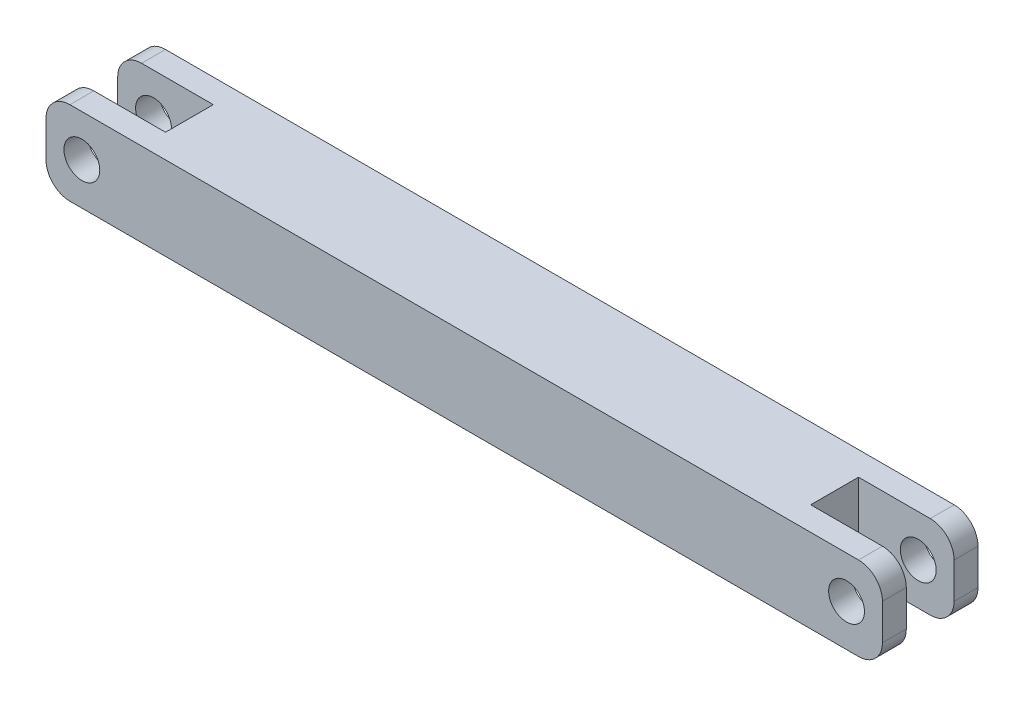
ISO-10303-21;
HEADER;
FILE_DESCRIPTION(('STEP AP214'),'2;1');
FILE_NAME('part.step','',(''),(''),'','','');
FILE_SCHEMA(('AUTOMOTIVE_DESIGN { 1 0 10303 214 1 1 1 1 }'));
ENDSEC;
DATA;
#1=APPLICATION_CONTEXT('core data for automotive mechanical design processes');
#2=APPLICATION_PROTOCOL_DEFINITION('international standard','automotive_design',2000,#1);
#3=PRODUCT_CONTEXT('',#1,'mechanical');
#4=PRODUCT('Part','Part','',(#3));
#5=PRODUCT_RELATED_PRODUCT_CATEGORY('part','',(#4));
#6=PRODUCT_DEFINITION_FORMATION('','',#4);
#7=PRODUCT_DEFINITION_CONTEXT('part definition',#1,'design');
#8=PRODUCT_DEFINITION('design','',#6,#7);
#9=PRODUCT_DEFINITION_SHAPE('','',#8);
#10=(LENGTH_UNIT() NAMED_UNIT(*) SI_UNIT(.MILLI.,.METRE.));
#11=(NAMED_UNIT(*) PLANE_ANGLE_UNIT() SI_UNIT($,.RADIAN.));
#12=(NAMED_UNIT(*) SI_UNIT($,.STERADIAN.) SOLID_ANGLE_UNIT());
#13=UNCERTAINTY_MEASURE_WITH_UNIT(LENGTH_MEASURE(1.E-05),#10,'distance_accuracy_value','');
#14=(GEOMETRIC_REPRESENTATION_CONTEXT(3) GLOBAL_UNCERTAINTY_ASSIGNED_CONTEXT((#13)) GLOBAL_UNIT_ASSIGNED_CONTEXT((#10,
#11,#12)) REPRESENTATION_CONTEXT('',''));
#15=CARTESIAN_POINT('',(0.,0.,0.));
#16=DIRECTION('',(0.,0.,1.));
#17=DIRECTION('',(1.,0.,0.));
#18=AXIS2_PLACEMENT_3D('',#15,#16,#17);
#19=CARTESIAN_POINT('',(175.,17.5,20.));
#20=DIRECTION('',(-1.,0.,0.));
#21=DIRECTION('',(0.,0.,1.));
#22=AXIS2_PLACEMENT_3D('',#19,#20,#21);
#23=PLANE('',#22);
#24=DIRECTION('',(0.,1.,0.));
#25=VECTOR('',#24,1.);
#26=CARTESIAN_POINT('',(175.,17.5,-10.));
#27=LINE('',#26,#25);
#28=CARTESIAN_POINT('',(175.,-7.5,-10.));
#29=VERTEX_POINT('',#28);
#30=CARTESIAN_POINT('',(175.,7.5,-10.));
#31=VERTEX_POINT('',#30);
#32=EDGE_CURVE('E211',#29,#31,#27,.T.);
#33=ORIENTED_EDGE('',*,*,#32,.F.);
#34=DIRECTION('',(0.,0.,-1.));
#35=VECTOR('',#34,1.);
#36=CARTESIAN_POINT('',(175.,-7.5,20.));
#37=LINE('',#36,#35);
#38=CARTESIAN_POINT('',(175.,-7.5,-20.));
#39=VERTEX_POINT('',#38);
#40=EDGE_CURVE('E335',#29,#39,#37,.T.);
#41=ORIENTED_EDGE('',*,*,#40,.T.);
#42=DIRECTION('',(0.,1.,0.));
#43=VECTOR('',#42,1.);
#44=CARTESIAN_POINT('',(175.,17.5,-20.));
#45=LINE('',#44,#43);
#46=CARTESIAN_POINT('',(175.,7.5,-20.));
#47=VERTEX_POINT('',#46);
#48=EDGE_CURVE('E248',#39,#47,#45,.T.);
#49=ORIENTED_EDGE('',*,*,#48,.T.);
#50=DIRECTION('',(0.,0.,-1.));
#51=VECTOR('',#50,1.);
#52=CARTESIAN_POINT('',(175.,7.5,20.));
#53=LINE('',#52,#51);
#54=EDGE_CURVE('E333',#47,#31,#53,.F.);
#55=ORIENTED_EDGE('',*,*,#54,.T.);
#56=EDGE_LOOP('',(#33,#41,#49,#55));
#57=FACE_BOUND('',#56,.T.);
#58=ADVANCED_FACE('F33',(#57),#23,.F.);
#59=DIRECTION('',(0.,1.,0.));
#60=VECTOR('',#59,1.);
#61=CARTESIAN_POINT('',(175.,17.5,20.));
#62=LINE('',#61,#60);
#63=CARTESIAN_POINT('',(175.,-7.5,20.));
#64=VERTEX_POINT('',#63);
#65=CARTESIAN_POINT('',(175.,7.5,20.));
#66=VERTEX_POINT('',#65);
#67=EDGE_CURVE('E249',#64,#66,#62,.T.);
#68=ORIENTED_EDGE('',*,*,#67,.F.);
#69=DIRECTION('',(0.,0.,-1.));
#70=VECTOR('',#69,1.);
#71=CARTESIAN_POINT('',(175.,-7.5,20.));
#72=LINE('',#71,#70);
#73=CARTESIAN_POINT('',(175.,-7.5,10.));
#74=VERTEX_POINT('',#73);
#75=EDGE_CURVE('E318',#64,#74,#72,.T.);
#76=ORIENTED_EDGE('',*,*,#75,.T.);
#77=DIRECTION('',(0.,-1.,0.));
#78=VECTOR('',#77,1.);
#79=CARTESIAN_POINT('',(175.,17.5,10.));
#80=LINE('',#79,#78);
#81=CARTESIAN_POINT('',(175.,7.5,10.));
#82=VERTEX_POINT('',#81);
#83=EDGE_CURVE('E208',#82,#74,#80,.T.);
#84=ORIENTED_EDGE('',*,*,#83,.F.);
#85=DIRECTION('',(0.,0.,-1.));
#86=VECTOR('',#85,1.);
#87=CARTESIAN_POINT('',(175.,7.5,20.));
#88=LINE('',#87,#86);
#89=EDGE_CURVE('E313',#82,#66,#88,.F.);
#90=ORIENTED_EDGE('',*,*,#89,.T.);
#91=EDGE_LOOP('',(#68,#76,#84,#90));
#92=FACE_BOUND('',#91,.T.);
#93=ADVANCED_FACE('F385',(#92),#23,.F.);
#94=CARTESIAN_POINT('',(-175.,17.5,20.));
#95=DIRECTION('',(0.,-1.,0.));
#96=DIRECTION('',(0.,0.,-1.));
#97=AXIS2_PLACEMENT_3D('',#94,#95,#96);
#98=PLANE('',#97);
#99=DIRECTION('',(1.,0.,0.));
#100=VECTOR('',#99,1.);
#101=CARTESIAN_POINT('',(215.,17.5,-10.));
#102=LINE('',#101,#100);
#103=CARTESIAN_POINT('',(135.,17.5,-10.));
#104=VERTEX_POINT('',#103);
#105=CARTESIAN_POINT('',(165.,17.5,-10.));
#106=VERTEX_POINT('',#105);
#107=EDGE_CURVE('E181',#104,#106,#102,.T.);
#108=ORIENTED_EDGE('',*,*,#107,.T.);
#109=DIRECTION('',(0.,0.,-1.));
#110=VECTOR('',#109,1.);
#111=CARTESIAN_POINT('',(165.,17.5,20.));
#112=LINE('',#111,#110);
#113=CARTESIAN_POINT('',(165.,17.5,-20.));
#114=VERTEX_POINT('',#113);
#115=EDGE_CURVE('E11',#106,#114,#112,.T.);
#116=ORIENTED_EDGE('',*,*,#115,.T.);
#117=DIRECTION('',(-1.,0.,0.));
#118=VECTOR('',#117,1.);
#119=CARTESIAN_POINT('',(-175.,17.5,-20.));
#120=LINE('',#119,#118);
#121=CARTESIAN_POINT('',(-165.,17.5,-20.));
#122=VERTEX_POINT('',#121);
#123=EDGE_CURVE('E264',#114,#122,#120,.T.);
#124=ORIENTED_EDGE('',*,*,#123,.T.);
#125=DIRECTION('',(0.,0.,-1.));
#126=VECTOR('',#125,1.);
#127=CARTESIAN_POINT('',(-165.,17.5,20.));
#128=LINE('',#127,#126);
#129=CARTESIAN_POINT('',(-165.,17.5,-10.));
#130=VERTEX_POINT('',#129);
#131=EDGE_CURVE('E310',#122,#130,#128,.F.);
#132=ORIENTED_EDGE('',*,*,#131,.T.);
#133=DIRECTION('',(-1.,0.,0.));
#134=VECTOR('',#133,1.);
#135=CARTESIAN_POINT('',(-215.,17.5,-10.));
#136=LINE('',#135,#134);
#137=CARTESIAN_POINT('',(-135.,17.5,-10.));
#138=VERTEX_POINT('',#137);
#139=EDGE_CURVE('E226',#138,#130,#136,.T.);
#140=ORIENTED_EDGE('',*,*,#139,.F.);
#141=DIRECTION('',(0.,0.,-1.));
#142=VECTOR('',#141,1.);
#143=CARTESIAN_POINT('',(-135.,17.5,-10.));
#144=LINE('',#143,#142);
#145=CARTESIAN_POINT('',(-135.,17.5,10.));
#146=VERTEX_POINT('',#145);
#147=EDGE_CURVE('E223',#146,#138,#144,.T.);
#148=ORIENTED_EDGE('',*,*,#147,.F.);
#149=DIRECTION('',(1.,0.,0.));
#150=VECTOR('',#149,1.);
#151=CARTESIAN_POINT('',(-215.,17.5,10.));
#152=LINE('',#151,#150);
#153=CARTESIAN_POINT('',(-165.,17.5,10.));
#154=VERTEX_POINT('',#153);
#155=EDGE_CURVE('E229',#154,#146,#152,.T.);
#156=ORIENTED_EDGE('',*,*,#155,.F.);
#157=DIRECTION('',(0.,0.,-1.));
#158=VECTOR('',#157,1.);
#159=CARTESIAN_POINT('',(-165.,17.5,20.));
#160=LINE('',#159,#158);
#161=CARTESIAN_POINT('',(-165.,17.5,20.));
#162=VERTEX_POINT('',#161);
#163=EDGE_CURVE('E307',#154,#162,#160,.F.);
#164=ORIENTED_EDGE('',*,*,#163,.T.);
#165=DIRECTION('',(-1.,0.,0.));
#166=VECTOR('',#165,1.);
#167=CARTESIAN_POINT('',(-175.,17.5,20.));
#168=LINE('',#167,#166);
#169=CARTESIAN_POINT('',(165.,17.5,20.));
#170=VERTEX_POINT('',#169);
#171=EDGE_CURVE('E252',#170,#162,#168,.T.);
#172=ORIENTED_EDGE('',*,*,#171,.F.);
#173=DIRECTION('',(0.,0.,-1.));
#174=VECTOR('',#173,1.);
#175=CARTESIAN_POINT('',(165.,17.5,20.));
#176=LINE('',#175,#174);
#177=CARTESIAN_POINT('',(165.,17.5,10.));
#178=VERTEX_POINT('',#177);
#179=EDGE_CURVE('E41',#170,#178,#176,.T.);
#180=ORIENTED_EDGE('',*,*,#179,.T.);
#181=DIRECTION('',(-1.,0.,0.));
#182=VECTOR('',#181,1.);
#183=CARTESIAN_POINT('',(215.,17.5,10.));
#184=LINE('',#183,#182);
#185=CARTESIAN_POINT('',(135.,17.5,10.));
#186=VERTEX_POINT('',#185);
#187=EDGE_CURVE('E173',#178,#186,#184,.T.);
#188=ORIENTED_EDGE('',*,*,#187,.T.);
#189=DIRECTION('',(0.,0.,-1.));
#190=VECTOR('',#189,1.);
#191=CARTESIAN_POINT('',(135.,17.5,-10.));
#192=LINE('',#191,#190);
#193=EDGE_CURVE('E177',#186,#104,#192,.T.);
#194=ORIENTED_EDGE('',*,*,#193,.T.);
#195=EDGE_LOOP('',(#108,#116,#124,#132,#140,#148,#156,#164,#172,#180,#188,#194));
#196=FACE_BOUND('',#195,.T.);
#197=ADVANCED_FACE('F175',(#196),#98,.F.);
#198=CARTESIAN_POINT('',(-175.,-17.5,20.));
#199=DIRECTION('',(0.,1.,0.));
#200=DIRECTION('',(0.,0.,1.));
#201=AXIS2_PLACEMENT_3D('',#198,#199,#200);
#202=PLANE('',#201);
#203=DIRECTION('',(-1.,0.,0.));
#204=VECTOR('',#203,1.);
#205=CARTESIAN_POINT('',(-175.,-17.5,10.));
#206=LINE('',#205,#204);
#207=CARTESIAN_POINT('',(165.,-17.5,10.));
#208=VERTEX_POINT('',#207);
#209=CARTESIAN_POINT('',(135.,-17.5,10.));
#210=VERTEX_POINT('',#209);
#211=EDGE_CURVE('E188',#208,#210,#206,.T.);
#212=ORIENTED_EDGE('',*,*,#211,.F.);
#213=DIRECTION('',(0.,0.,-1.));
#214=VECTOR('',#213,1.);
#215=CARTESIAN_POINT('',(165.,-17.5,20.));
#216=LINE('',#215,#214);
#217=CARTESIAN_POINT('',(165.,-17.5,20.));
#218=VERTEX_POINT('',#217);
#219=EDGE_CURVE('E327',#208,#218,#216,.F.);
#220=ORIENTED_EDGE('',*,*,#219,.T.);
#221=DIRECTION('',(1.,0.,0.));
#222=VECTOR('',#221,1.);
#223=CARTESIAN_POINT('',(-175.,-17.5,20.));
#224=LINE('',#223,#222);
#225=CARTESIAN_POINT('',(-165.,-17.5,20.));
#226=VERTEX_POINT('',#225);
#227=EDGE_CURVE('E258',#226,#218,#224,.T.);
#228=ORIENTED_EDGE('',*,*,#227,.F.);
#229=DIRECTION('',(0.,0.,-1.));
#230=VECTOR('',#229,1.);
#231=CARTESIAN_POINT('',(-165.,-17.5,20.));
#232=LINE('',#231,#230);
#233=CARTESIAN_POINT('',(-165.,-17.5,10.));
#234=VERTEX_POINT('',#233);
#235=EDGE_CURVE('E272',#226,#234,#232,.T.);
#236=ORIENTED_EDGE('',*,*,#235,.T.);
#237=DIRECTION('',(1.,0.,0.));
#238=VECTOR('',#237,1.);
#239=CARTESIAN_POINT('',(-175.,-17.5,10.));
#240=LINE('',#239,#238);
#241=CARTESIAN_POINT('',(-135.,-17.5,10.));
#242=VERTEX_POINT('',#241);
#243=EDGE_CURVE('E261',#234,#242,#240,.T.);
#244=ORIENTED_EDGE('',*,*,#243,.T.);
#245=DIRECTION('',(0.,0.,-1.));
#246=VECTOR('',#245,1.);
#247=CARTESIAN_POINT('',(-135.,-17.5,-10.));
#248=LINE('',#247,#246);
#249=CARTESIAN_POINT('',(-135.,-17.5,-10.));
#250=VERTEX_POINT('',#249);
#251=EDGE_CURVE('E231',#242,#250,#248,.T.);
#252=ORIENTED_EDGE('',*,*,#251,.T.);
#253=DIRECTION('',(-1.,0.,0.));
#254=VECTOR('',#253,1.);
#255=CARTESIAN_POINT('',(-215.,-17.5,-10.));
#256=LINE('',#255,#254);
#257=CARTESIAN_POINT('',(-165.,-17.5,-10.));
#258=VERTEX_POINT('',#257);
#259=EDGE_CURVE('E234',#250,#258,#256,.T.);
#260=ORIENTED_EDGE('',*,*,#259,.T.);
#261=DIRECTION('',(0.,0.,-1.));
#262=VECTOR('',#261,1.);
#263=CARTESIAN_POINT('',(-165.,-17.5,20.));
#264=LINE('',#263,#262);
#265=CARTESIAN_POINT('',(-165.,-17.5,-20.));
#266=VERTEX_POINT('',#265);
#267=EDGE_CURVE('E277',#258,#266,#264,.T.);
#268=ORIENTED_EDGE('',*,*,#267,.T.);
#269=DIRECTION('',(1.,0.,0.));
#270=VECTOR('',#269,1.);
#271=CARTESIAN_POINT('',(-175.,-17.5,-20.));
#272=LINE('',#271,#270);
#273=CARTESIAN_POINT('',(165.,-17.5,-20.));
#274=VERTEX_POINT('',#273);
#275=EDGE_CURVE('E253',#266,#274,#272,.T.);
#276=ORIENTED_EDGE('',*,*,#275,.T.);
#277=DIRECTION('',(0.,0.,-1.));
#278=VECTOR('',#277,1.);
#279=CARTESIAN_POINT('',(165.,-17.5,20.));
#280=LINE('',#279,#278);
#281=CARTESIAN_POINT('',(165.,-17.5,-10.));
#282=VERTEX_POINT('',#281);
#283=EDGE_CURVE('E325',#274,#282,#280,.F.);
#284=ORIENTED_EDGE('',*,*,#283,.T.);
#285=DIRECTION('',(1.,0.,0.));
#286=VECTOR('',#285,1.);
#287=CARTESIAN_POINT('',(215.,-17.5,-10.));
#288=LINE('',#287,#286);
#289=CARTESIAN_POINT('',(135.,-17.5,-10.));
#290=VERTEX_POINT('',#289);
#291=EDGE_CURVE('E192',#290,#282,#288,.T.);
#292=ORIENTED_EDGE('',*,*,#291,.F.);
#293=DIRECTION('',(0.,0.,-1.));
#294=VECTOR('',#293,1.);
#295=CARTESIAN_POINT('',(135.,-17.5,-10.));
#296=LINE('',#295,#294);
#297=EDGE_CURVE('E204',#210,#290,#296,.T.);
#298=ORIENTED_EDGE('',*,*,#297,.F.);
#299=EDGE_LOOP('',(#212,#220,#228,#236,#244,#252,#260,#268,#276,#284,#292,#298));
#300=FACE_BOUND('',#299,.T.);
#301=ADVANCED_FACE('F357',(#300),#202,.F.);
#302=CARTESIAN_POINT('',(-175.,17.5,20.));
#303=DIRECTION('',(1.,0.,0.));
#304=DIRECTION('',(0.,0.,-1.));
#305=AXIS2_PLACEMENT_3D('',#302,#303,#304);
#306=PLANE('',#305);
#307=DIRECTION('',(0.,-1.,0.));
#308=VECTOR('',#307,1.);
#309=CARTESIAN_POINT('',(-175.,17.5,10.));
#310=LINE('',#309,#308);
#311=CARTESIAN_POINT('',(-175.,7.5,10.));
#312=VERTEX_POINT('',#311);
#313=CARTESIAN_POINT('',(-175.,-7.5,10.));
#314=VERTEX_POINT('',#313);
#315=EDGE_CURVE('E245',#312,#314,#310,.T.);
#316=ORIENTED_EDGE('',*,*,#315,.T.);
#317=DIRECTION('',(0.,0.,-1.));
#318=VECTOR('',#317,1.);
#319=CARTESIAN_POINT('',(-175.,-7.5,20.));
#320=LINE('',#319,#318);
#321=CARTESIAN_POINT('',(-175.,-7.5,20.));
#322=VERTEX_POINT('',#321);
#323=EDGE_CURVE('E301',#314,#322,#320,.F.);
#324=ORIENTED_EDGE('',*,*,#323,.T.);
#325=DIRECTION('',(0.,-1.,0.));
#326=VECTOR('',#325,1.);
#327=CARTESIAN_POINT('',(-175.,17.5,20.));
#328=LINE('',#327,#326);
#329=CARTESIAN_POINT('',(-175.,7.5,20.));
#330=VERTEX_POINT('',#329);
#331=EDGE_CURVE('E255',#330,#322,#328,.T.);
#332=ORIENTED_EDGE('',*,*,#331,.F.);
#333=DIRECTION('',(0.,0.,-1.));
#334=VECTOR('',#333,1.);
#335=CARTESIAN_POINT('',(-175.,7.5,20.));
#336=LINE('',#335,#334);
#337=EDGE_CURVE('E298',#330,#312,#336,.T.);
#338=ORIENTED_EDGE('',*,*,#337,.T.);
#339=EDGE_LOOP('',(#316,#324,#332,#338));
#340=FACE_BOUND('',#339,.T.);
#341=ADVANCED_FACE('F434',(#340),#306,.F.);
#342=DIRECTION('',(0.,-1.,0.));
#343=VECTOR('',#342,1.);
#344=CARTESIAN_POINT('',(-175.,17.5,-20.));
#345=LINE('',#344,#343);
#346=CARTESIAN_POINT('',(-175.,7.5,-20.));
#347=VERTEX_POINT('',#346);
#348=CARTESIAN_POINT('',(-175.,-7.5,-20.));
#349=VERTEX_POINT('',#348);
#350=EDGE_CURVE('E266',#347,#349,#345,.T.);
#351=ORIENTED_EDGE('',*,*,#350,.T.);
#352=DIRECTION('',(0.,0.,-1.));
#353=VECTOR('',#352,1.);
#354=CARTESIAN_POINT('',(-175.,-7.5,20.));
#355=LINE('',#354,#353);
#356=CARTESIAN_POINT('',(-175.,-7.5,-10.));
#357=VERTEX_POINT('',#356);
#358=EDGE_CURVE('E288',#349,#357,#355,.F.);
#359=ORIENTED_EDGE('',*,*,#358,.T.);
#360=DIRECTION('',(0.,1.,0.));
#361=VECTOR('',#360,1.);
#362=CARTESIAN_POINT('',(-175.,17.5,-10.));
#363=LINE('',#362,#361);
#364=CARTESIAN_POINT('',(-175.,7.5,-10.));
#365=VERTEX_POINT('',#364);
#366=EDGE_CURVE('E241',#357,#365,#363,.T.);
#367=ORIENTED_EDGE('',*,*,#366,.T.);
#368=DIRECTION('',(0.,0.,-1.));
#369=VECTOR('',#368,1.);
#370=CARTESIAN_POINT('',(-175.,7.5,20.));
#371=LINE('',#370,#369);
#372=EDGE_CURVE('E285',#365,#347,#371,.T.);
#373=ORIENTED_EDGE('',*,*,#372,.T.);
#374=EDGE_LOOP('',(#351,#359,#367,#373));
#375=FACE_BOUND('',#374,.T.);
#376=ADVANCED_FACE('F366',(#375),#306,.F.);
#377=CARTESIAN_POINT('',(0.,0.,20.));
#378=DIRECTION('',(0.,0.,1.));
#379=DIRECTION('',(1.,0.,0.));
#380=AXIS2_PLACEMENT_3D('',#377,#378,#379);
#381=PLANE('',#380);
#382=CARTESIAN_POINT('',(160.,0.,20.));
#383=DIRECTION('',(0.,0.,-1.));
#384=DIRECTION('',(-1.,0.,0.));
#385=AXIS2_PLACEMENT_3D('',#382,#383,#384);
#386=CIRCLE('',#385,7.50000000000001);
#387=CARTESIAN_POINT('',(152.5,0.,20.));
#388=VERTEX_POINT('',#387);
#389=EDGE_CURVE('E639',#388,#388,#386,.T.);
#390=ORIENTED_EDGE('',*,*,#389,.T.);
#391=EDGE_LOOP('',(#390));
#392=FACE_BOUND('',#391,.T.);
#393=CARTESIAN_POINT('',(-160.,0.,20.));
#394=DIRECTION('',(0.,0.,1.));
#395=DIRECTION('',(1.,0.,0.));
#396=AXIS2_PLACEMENT_3D('',#393,#394,#395);
#397=CIRCLE('',#396,7.50000000000001);
#398=CARTESIAN_POINT('',(-152.5,0.,20.));
#399=VERTEX_POINT('',#398);
#400=EDGE_CURVE('E213',#399,#399,#397,.T.);
#401=ORIENTED_EDGE('',*,*,#400,.F.);
#402=EDGE_LOOP('',(#401));
#403=FACE_BOUND('',#402,.T.);
#404=ORIENTED_EDGE('',*,*,#227,.T.);
#405=CARTESIAN_POINT('',(165.,-7.5,20.));
#406=DIRECTION('',(0.,0.,1.));
#407=DIRECTION('',(1.,0.,0.));
#408=AXIS2_PLACEMENT_3D('',#405,#406,#407);
#409=CIRCLE('',#408,10.);
#410=EDGE_CURVE('E331',#218,#64,#409,.T.);
#411=ORIENTED_EDGE('',*,*,#410,.T.);
#412=ORIENTED_EDGE('',*,*,#67,.T.);
#413=CARTESIAN_POINT('',(165.,7.5,20.));
#414=DIRECTION('',(0.,0.,1.));
#415=DIRECTION('',(1.,0.,0.));
#416=AXIS2_PLACEMENT_3D('',#413,#414,#415);
#417=CIRCLE('',#416,10.);
#418=EDGE_CURVE('E329',#66,#170,#417,.T.);
#419=ORIENTED_EDGE('',*,*,#418,.T.);
#420=ORIENTED_EDGE('',*,*,#171,.T.);
#421=CARTESIAN_POINT('',(-165.,7.5,20.));
#422=DIRECTION('',(0.,0.,1.));
#423=DIRECTION('',(1.,0.,0.));
#424=AXIS2_PLACEMENT_3D('',#421,#422,#423);
#425=CIRCLE('',#424,10.);
#426=EDGE_CURVE('E303',#162,#330,#425,.T.);
#427=ORIENTED_EDGE('',*,*,#426,.T.);
#428=ORIENTED_EDGE('',*,*,#331,.T.);
#429=CARTESIAN_POINT('',(-165.,-7.5,20.));
#430=DIRECTION('',(0.,0.,1.));
#431=DIRECTION('',(1.,0.,0.));
#432=AXIS2_PLACEMENT_3D('',#429,#430,#431);
#433=CIRCLE('',#432,10.);
#434=EDGE_CURVE('E305',#322,#226,#433,.T.);
#435=ORIENTED_EDGE('',*,*,#434,.T.);
#436=EDGE_LOOP('',(#404,#411,#412,#419,#420,#427,#428,#435));
#437=FACE_BOUND('',#436,.T.);
#438=ADVANCED_FACE('F421',(#392,#403,#437),#381,.T.);
#439=CARTESIAN_POINT('',(0.,0.,-20.));
#440=DIRECTION('',(0.,0.,1.));
#441=DIRECTION('',(1.,0.,0.));
#442=AXIS2_PLACEMENT_3D('',#439,#440,#441);
#443=PLANE('',#442);
#444=CARTESIAN_POINT('',(160.,0.,-20.));
#445=DIRECTION('',(0.,0.,-1.));
#446=DIRECTION('',(-1.,0.,0.));
#447=AXIS2_PLACEMENT_3D('',#444,#445,#446);
#448=CIRCLE('',#447,7.50000000000001);
#449=CARTESIAN_POINT('',(152.5,0.,-20.));
#450=VERTEX_POINT('',#449);
#451=EDGE_CURVE('E316',#450,#450,#448,.T.);
#452=ORIENTED_EDGE('',*,*,#451,.F.);
#453=EDGE_LOOP('',(#452));
#454=FACE_BOUND('',#453,.T.);
#455=CARTESIAN_POINT('',(-160.,0.,-20.));
#456=DIRECTION('',(0.,0.,1.));
#457=DIRECTION('',(1.,0.,0.));
#458=AXIS2_PLACEMENT_3D('',#455,#456,#457);
#459=CIRCLE('',#458,7.50000000000001);
#460=CARTESIAN_POINT('',(-152.5,0.,-20.));
#461=VERTEX_POINT('',#460);
#462=EDGE_CURVE('E216',#461,#461,#459,.T.);
#463=ORIENTED_EDGE('',*,*,#462,.T.);
#464=EDGE_LOOP('',(#463));
#465=FACE_BOUND('',#464,.T.);
#466=ORIENTED_EDGE('',*,*,#48,.F.);
#467=CARTESIAN_POINT('',(165.,-7.5,-20.));
#468=DIRECTION('',(0.,0.,1.));
#469=DIRECTION('',(1.,0.,0.));
#470=AXIS2_PLACEMENT_3D('',#467,#468,#469);
#471=CIRCLE('',#470,10.);
#472=EDGE_CURVE('E339',#39,#274,#471,.F.);
#473=ORIENTED_EDGE('',*,*,#472,.T.);
#474=ORIENTED_EDGE('',*,*,#275,.F.);
#475=CARTESIAN_POINT('',(-165.,-7.5,-20.));
#476=DIRECTION('',(0.,0.,1.));
#477=DIRECTION('',(1.,0.,0.));
#478=AXIS2_PLACEMENT_3D('',#475,#476,#477);
#479=CIRCLE('',#478,10.);
#480=EDGE_CURVE('E283',#266,#349,#479,.F.);
#481=ORIENTED_EDGE('',*,*,#480,.T.);
#482=ORIENTED_EDGE('',*,*,#350,.F.);
#483=CARTESIAN_POINT('',(-165.,7.5,-20.));
#484=DIRECTION('',(0.,0.,1.));
#485=DIRECTION('',(1.,0.,0.));
#486=AXIS2_PLACEMENT_3D('',#483,#484,#485);
#487=CIRCLE('',#486,10.);
#488=EDGE_CURVE('E280',#347,#122,#487,.F.);
#489=ORIENTED_EDGE('',*,*,#488,.T.);
#490=ORIENTED_EDGE('',*,*,#123,.F.);
#491=CARTESIAN_POINT('',(165.,7.5,-20.));
#492=DIRECTION('',(0.,0.,1.));
#493=DIRECTION('',(1.,0.,0.));
#494=AXIS2_PLACEMENT_3D('',#491,#492,#493);
#495=CIRCLE('',#494,10.);
#496=EDGE_CURVE('E56',#114,#47,#495,.F.);
#497=ORIENTED_EDGE('',*,*,#496,.T.);
#498=EDGE_LOOP('',(#466,#473,#474,#481,#482,#489,#490,#497));
#499=FACE_BOUND('',#498,.T.);
#500=ADVANCED_FACE('F355',(#454,#465,#499),#443,.F.);
#501=CARTESIAN_POINT('',(-215.,-17.5,10.));
#502=DIRECTION('',(0.,0.,1.));
#503=DIRECTION('',(1.,0.,0.));
#504=AXIS2_PLACEMENT_3D('',#501,#502,#503);
#505=PLANE('',#504);
#506=CARTESIAN_POINT('',(-160.,0.,10.));
#507=DIRECTION('',(0.,0.,1.));
#508=DIRECTION('',(1.,0.,0.));
#509=AXIS2_PLACEMENT_3D('',#506,#507,#508);
#510=CIRCLE('',#509,7.50000000000001);
#511=CARTESIAN_POINT('',(-152.5,0.,10.));
#512=VERTEX_POINT('',#511);
#513=EDGE_CURVE('E220',#512,#512,#510,.T.);
#514=ORIENTED_EDGE('',*,*,#513,.T.);
#515=EDGE_LOOP('',(#514));
#516=FACE_BOUND('',#515,.T.);
#517=ORIENTED_EDGE('',*,*,#243,.F.);
#518=CARTESIAN_POINT('',(-165.,-7.5,10.));
#519=DIRECTION('',(0.,0.,1.));
#520=DIRECTION('',(1.,0.,0.));
#521=AXIS2_PLACEMENT_3D('',#518,#519,#520);
#522=CIRCLE('',#521,10.);
#523=EDGE_CURVE('E296',#234,#314,#522,.F.);
#524=ORIENTED_EDGE('',*,*,#523,.T.);
#525=ORIENTED_EDGE('',*,*,#315,.F.);
#526=CARTESIAN_POINT('',(-165.,7.5,10.));
#527=DIRECTION('',(0.,0.,1.));
#528=DIRECTION('',(1.,0.,0.));
#529=AXIS2_PLACEMENT_3D('',#526,#527,#528);
#530=CIRCLE('',#529,10.);
#531=EDGE_CURVE('E294',#312,#154,#530,.F.);
#532=ORIENTED_EDGE('',*,*,#531,.T.);
#533=ORIENTED_EDGE('',*,*,#155,.T.);
#534=DIRECTION('',(0.,1.,0.));
#535=VECTOR('',#534,1.);
#536=CARTESIAN_POINT('',(-135.,-17.5,10.));
#537=LINE('',#536,#535);
#538=EDGE_CURVE('E238',#242,#146,#537,.T.);
#539=ORIENTED_EDGE('',*,*,#538,.F.);
#540=EDGE_LOOP('',(#517,#524,#525,#532,#533,#539));
#541=FACE_BOUND('',#540,.T.);
#542=ADVANCED_FACE('F441',(#516,#541),#505,.F.);
#543=CARTESIAN_POINT('',(-215.,-17.5,-10.));
#544=DIRECTION('',(0.,0.,-1.));
#545=DIRECTION('',(-1.,0.,0.));
#546=AXIS2_PLACEMENT_3D('',#543,#544,#545);
#547=PLANE('',#546);
#548=CARTESIAN_POINT('',(-160.,0.,-10.));
#549=DIRECTION('',(0.,0.,-1.));
#550=DIRECTION('',(-1.,0.,0.));
#551=AXIS2_PLACEMENT_3D('',#548,#549,#550);
#552=CIRCLE('',#551,7.50000000000001);
#553=CARTESIAN_POINT('',(-167.5,0.,-10.));
#554=VERTEX_POINT('',#553);
#555=EDGE_CURVE('E219',#554,#554,#552,.T.);
#556=ORIENTED_EDGE('',*,*,#555,.T.);
#557=EDGE_LOOP('',(#556));
#558=FACE_BOUND('',#557,.T.);
#559=ORIENTED_EDGE('',*,*,#366,.F.);
#560=CARTESIAN_POINT('',(-165.,-7.5,-10.));
#561=DIRECTION('',(0.,0.,-1.));
#562=DIRECTION('',(-1.,0.,0.));
#563=AXIS2_PLACEMENT_3D('',#560,#561,#562);
#564=CIRCLE('',#563,10.);
#565=EDGE_CURVE('E292',#357,#258,#564,.F.);
#566=ORIENTED_EDGE('',*,*,#565,.T.);
#567=ORIENTED_EDGE('',*,*,#259,.F.);
#568=DIRECTION('',(0.,1.,0.));
#569=VECTOR('',#568,1.);
#570=CARTESIAN_POINT('',(-135.,-17.5,-10.));
#571=LINE('',#570,#569);
#572=EDGE_CURVE('E237',#250,#138,#571,.T.);
#573=ORIENTED_EDGE('',*,*,#572,.T.);
#574=ORIENTED_EDGE('',*,*,#139,.T.);
#575=CARTESIAN_POINT('',(-165.,7.5,-10.));
#576=DIRECTION('',(0.,0.,-1.));
#577=DIRECTION('',(-1.,0.,0.));
#578=AXIS2_PLACEMENT_3D('',#575,#576,#577);
#579=CIRCLE('',#578,10.);
#580=EDGE_CURVE('E290',#130,#365,#579,.F.);
#581=ORIENTED_EDGE('',*,*,#580,.T.);
#582=EDGE_LOOP('',(#559,#566,#567,#573,#574,#581));
#583=FACE_BOUND('',#582,.T.);
#584=ADVANCED_FACE('F446',(#558,#583),#547,.F.);
#585=CARTESIAN_POINT('',(-135.,-17.5,-10.));
#586=DIRECTION('',(1.,0.,0.));
#587=DIRECTION('',(0.,0.,-1.));
#588=AXIS2_PLACEMENT_3D('',#585,#586,#587);
#589=PLANE('',#588);
#590=ORIENTED_EDGE('',*,*,#572,.F.);
#591=ORIENTED_EDGE('',*,*,#251,.F.);
#592=ORIENTED_EDGE('',*,*,#538,.T.);
#593=ORIENTED_EDGE('',*,*,#147,.T.);
#594=EDGE_LOOP('',(#590,#591,#592,#593));
#595=FACE_BOUND('',#594,.T.);
#596=ADVANCED_FACE('F444',(#595),#589,.F.);
#597=CARTESIAN_POINT('',(-160.,0.,-20.));
#598=DIRECTION('',(0.,0.,1.));
#599=DIRECTION('',(1.,0.,0.));
#600=AXIS2_PLACEMENT_3D('',#597,#598,#599);
#601=CYLINDRICAL_SURFACE('',#600,7.50000000000001);
#602=ORIENTED_EDGE('',*,*,#462,.F.);
#603=EDGE_LOOP('',(#602));
#604=FACE_BOUND('',#603,.T.);
#605=ORIENTED_EDGE('',*,*,#555,.F.);
#606=EDGE_LOOP('',(#605));
#607=FACE_BOUND('',#606,.T.);
#608=ADVANCED_FACE('F454',(#604,#607),#601,.F.);
#609=ORIENTED_EDGE('',*,*,#400,.T.);
#610=EDGE_LOOP('',(#609));
#611=FACE_BOUND('',#610,.T.);
#612=ORIENTED_EDGE('',*,*,#513,.F.);
#613=EDGE_LOOP('',(#612));
#614=FACE_BOUND('',#613,.T.);
#615=ADVANCED_FACE('F397',(#611,#614),#601,.F.);
#616=CARTESIAN_POINT('',(-165.,-7.5,20.));
#617=DIRECTION('',(0.,0.,-1.));
#618=DIRECTION('',(-1.,0.,0.));
#619=AXIS2_PLACEMENT_3D('',#616,#617,#618);
#620=CYLINDRICAL_SURFACE('',#619,10.);
#621=ORIENTED_EDGE('',*,*,#565,.F.);
#622=ORIENTED_EDGE('',*,*,#358,.F.);
#623=ORIENTED_EDGE('',*,*,#480,.F.);
#624=ORIENTED_EDGE('',*,*,#267,.F.);
#625=EDGE_LOOP('',(#621,#622,#623,#624));
#626=FACE_BOUND('',#625,.T.);
#627=ADVANCED_FACE('F362',(#626),#620,.T.);
#628=CARTESIAN_POINT('',(-165.,-7.5,20.));
#629=DIRECTION('',(0.,0.,-1.));
#630=DIRECTION('',(-1.,0.,0.));
#631=AXIS2_PLACEMENT_3D('',#628,#629,#630);
#632=CYLINDRICAL_SURFACE('',#631,10.);
#633=ORIENTED_EDGE('',*,*,#434,.F.);
#634=ORIENTED_EDGE('',*,*,#323,.F.);
#635=ORIENTED_EDGE('',*,*,#523,.F.);
#636=ORIENTED_EDGE('',*,*,#235,.F.);
#637=EDGE_LOOP('',(#633,#634,#635,#636));
#638=FACE_BOUND('',#637,.T.);
#639=ADVANCED_FACE('F396',(#638),#632,.T.);
#640=CARTESIAN_POINT('',(-165.,7.5,20.));
#641=DIRECTION('',(0.,0.,-1.));
#642=DIRECTION('',(-1.,0.,0.));
#643=AXIS2_PLACEMENT_3D('',#640,#641,#642);
#644=CYLINDRICAL_SURFACE('',#643,10.);
#645=ORIENTED_EDGE('',*,*,#580,.F.);
#646=ORIENTED_EDGE('',*,*,#131,.F.);
#647=ORIENTED_EDGE('',*,*,#488,.F.);
#648=ORIENTED_EDGE('',*,*,#372,.F.);
#649=EDGE_LOOP('',(#645,#646,#647,#648));
#650=FACE_BOUND('',#649,.T.);
#651=ADVANCED_FACE('F371',(#650),#644,.T.);
#652=CARTESIAN_POINT('',(-165.,7.5,20.));
#653=DIRECTION('',(0.,0.,-1.));
#654=DIRECTION('',(-1.,0.,0.));
#655=AXIS2_PLACEMENT_3D('',#652,#653,#654);
#656=CYLINDRICAL_SURFACE('',#655,10.);
#657=ORIENTED_EDGE('',*,*,#426,.F.);
#658=ORIENTED_EDGE('',*,*,#163,.F.);
#659=ORIENTED_EDGE('',*,*,#531,.F.);
#660=ORIENTED_EDGE('',*,*,#337,.F.);
#661=EDGE_LOOP('',(#657,#658,#659,#660));
#662=FACE_BOUND('',#661,.T.);
#663=ADVANCED_FACE('F403',(#662),#656,.T.);
#664=CARTESIAN_POINT('',(215.,-17.5,-10.));
#665=DIRECTION('',(0.,0.,1.));
#666=DIRECTION('',(1.,0.,0.));
#667=AXIS2_PLACEMENT_3D('',#664,#665,#666);
#668=PLANE('',#667);
#669=CARTESIAN_POINT('',(160.,0.,-10.));
#670=DIRECTION('',(0.,0.,1.));
#671=DIRECTION('',(1.,0.,0.));
#672=AXIS2_PLACEMENT_3D('',#669,#670,#671);
#673=CIRCLE('',#672,7.50000000000001);
#674=CARTESIAN_POINT('',(167.5,0.,-10.));
#675=VERTEX_POINT('',#674);
#676=EDGE_CURVE('E196',#675,#675,#673,.F.);
#677=ORIENTED_EDGE('',*,*,#676,.T.);
#678=EDGE_LOOP('',(#677));
#679=FACE_BOUND('',#678,.T.);
#680=ORIENTED_EDGE('',*,*,#291,.T.);
#681=CARTESIAN_POINT('',(165.,-7.5,-10.));
#682=DIRECTION('',(0.,0.,1.));
#683=DIRECTION('',(1.,0.,0.));
#684=AXIS2_PLACEMENT_3D('',#681,#682,#683);
#685=CIRCLE('',#684,10.);
#686=EDGE_CURVE('E342',#282,#29,#685,.T.);
#687=ORIENTED_EDGE('',*,*,#686,.T.);
#688=ORIENTED_EDGE('',*,*,#32,.T.);
#689=CARTESIAN_POINT('',(165.,7.5,-10.));
#690=DIRECTION('',(0.,0.,1.));
#691=DIRECTION('',(1.,0.,0.));
#692=AXIS2_PLACEMENT_3D('',#689,#690,#691);
#693=CIRCLE('',#692,10.);
#694=EDGE_CURVE('E48',#31,#106,#693,.T.);
#695=ORIENTED_EDGE('',*,*,#694,.T.);
#696=ORIENTED_EDGE('',*,*,#107,.F.);
#697=DIRECTION('',(0.,1.,0.));
#698=VECTOR('',#697,1.);
#699=CARTESIAN_POINT('',(135.,-17.5,-10.));
#700=LINE('',#699,#698);
#701=EDGE_CURVE('E191',#290,#104,#700,.T.);
#702=ORIENTED_EDGE('',*,*,#701,.F.);
#703=EDGE_LOOP('',(#680,#687,#688,#695,#696,#702));
#704=FACE_BOUND('',#703,.T.);
#705=ADVANCED_FACE('F345',(#679,#704),#668,.T.);
#706=CARTESIAN_POINT('',(215.,-17.5,10.));
#707=DIRECTION('',(0.,0.,-1.));
#708=DIRECTION('',(-1.,0.,0.));
#709=AXIS2_PLACEMENT_3D('',#706,#707,#708);
#710=PLANE('',#709);
#711=CARTESIAN_POINT('',(160.,0.,10.));
#712=DIRECTION('',(0.,0.,-1.));
#713=DIRECTION('',(-1.,0.,0.));
#714=AXIS2_PLACEMENT_3D('',#711,#712,#713);
#715=CIRCLE('',#714,7.50000000000001);
#716=CARTESIAN_POINT('',(152.5,0.,10.));
#717=VERTEX_POINT('',#716);
#718=EDGE_CURVE('E199',#717,#717,#715,.F.);
#719=ORIENTED_EDGE('',*,*,#718,.T.);
#720=EDGE_LOOP('',(#719));
#721=FACE_BOUND('',#720,.T.);
#722=ORIENTED_EDGE('',*,*,#83,.T.);
#723=CARTESIAN_POINT('',(165.,-7.5,10.));
#724=DIRECTION('',(0.,0.,-1.));
#725=DIRECTION('',(-1.,0.,0.));
#726=AXIS2_PLACEMENT_3D('',#723,#724,#725);
#727=CIRCLE('',#726,10.);
#728=EDGE_CURVE('E323',#74,#208,#727,.T.);
#729=ORIENTED_EDGE('',*,*,#728,.T.);
#730=ORIENTED_EDGE('',*,*,#211,.T.);
#731=DIRECTION('',(0.,1.,0.));
#732=VECTOR('',#731,1.);
#733=CARTESIAN_POINT('',(135.,-17.5,10.));
#734=LINE('',#733,#732);
#735=EDGE_CURVE('E184',#210,#186,#734,.T.);
#736=ORIENTED_EDGE('',*,*,#735,.T.);
#737=ORIENTED_EDGE('',*,*,#187,.F.);
#738=CARTESIAN_POINT('',(165.,7.5,10.));
#739=DIRECTION('',(0.,0.,-1.));
#740=DIRECTION('',(-1.,0.,0.));
#741=AXIS2_PLACEMENT_3D('',#738,#739,#740);
#742=CIRCLE('',#741,10.);
#743=EDGE_CURVE('E321',#178,#82,#742,.T.);
#744=ORIENTED_EDGE('',*,*,#743,.T.);
#745=EDGE_LOOP('',(#722,#729,#730,#736,#737,#744));
#746=FACE_BOUND('',#745,.T.);
#747=ADVANCED_FACE('F186',(#721,#746),#710,.T.);
#748=CARTESIAN_POINT('',(135.,-17.5,-10.));
#749=DIRECTION('',(1.,0.,0.));
#750=DIRECTION('',(0.,0.,-1.));
#751=AXIS2_PLACEMENT_3D('',#748,#749,#750);
#752=PLANE('',#751);
#753=ORIENTED_EDGE('',*,*,#735,.F.);
#754=ORIENTED_EDGE('',*,*,#297,.T.);
#755=ORIENTED_EDGE('',*,*,#701,.T.);
#756=ORIENTED_EDGE('',*,*,#193,.F.);
#757=EDGE_LOOP('',(#753,#754,#755,#756));
#758=FACE_BOUND('',#757,.T.);
#759=ADVANCED_FACE('F194',(#758),#752,.T.);
#760=CARTESIAN_POINT('',(160.,0.,-20.));
#761=DIRECTION('',(0.,0.,1.));
#762=DIRECTION('',(1.,0.,0.));
#763=AXIS2_PLACEMENT_3D('',#760,#761,#762);
#764=CYLINDRICAL_SURFACE('',#763,7.50000000000001);
#765=ORIENTED_EDGE('',*,*,#718,.F.);
#766=EDGE_LOOP('',(#765));
#767=FACE_BOUND('',#766,.T.);
#768=ORIENTED_EDGE('',*,*,#389,.F.);
#769=EDGE_LOOP('',(#768));
#770=FACE_BOUND('',#769,.T.);
#771=ADVANCED_FACE('F413',(#767,#770),#764,.F.);
#772=ORIENTED_EDGE('',*,*,#676,.F.);
#773=EDGE_LOOP('',(#772));
#774=FACE_BOUND('',#773,.T.);
#775=ORIENTED_EDGE('',*,*,#451,.T.);
#776=EDGE_LOOP('',(#775));
#777=FACE_BOUND('',#776,.T.);
#778=ADVANCED_FACE('F408',(#774,#777),#764,.F.);
#779=CARTESIAN_POINT('',(165.,-7.5,20.));
#780=DIRECTION('',(0.,0.,-1.));
#781=DIRECTION('',(-1.,0.,0.));
#782=AXIS2_PLACEMENT_3D('',#779,#780,#781);
#783=CYLINDRICAL_SURFACE('',#782,10.);
#784=ORIENTED_EDGE('',*,*,#410,.F.);
#785=ORIENTED_EDGE('',*,*,#219,.F.);
#786=ORIENTED_EDGE('',*,*,#728,.F.);
#787=ORIENTED_EDGE('',*,*,#75,.F.);
#788=EDGE_LOOP('',(#784,#785,#786,#787));
#789=FACE_BOUND('',#788,.T.);
#790=ADVANCED_FACE('F382',(#789),#783,.T.);
#791=CARTESIAN_POINT('',(165.,-7.5,20.));
#792=DIRECTION('',(0.,0.,-1.));
#793=DIRECTION('',(-1.,0.,0.));
#794=AXIS2_PLACEMENT_3D('',#791,#792,#793);
#795=CYLINDRICAL_SURFACE('',#794,10.);
#796=ORIENTED_EDGE('',*,*,#686,.F.);
#797=ORIENTED_EDGE('',*,*,#283,.F.);
#798=ORIENTED_EDGE('',*,*,#472,.F.);
#799=ORIENTED_EDGE('',*,*,#40,.F.);
#800=EDGE_LOOP('',(#796,#797,#798,#799));
#801=FACE_BOUND('',#800,.T.);
#802=ADVANCED_FACE('F352',(#801),#795,.T.);
#803=CARTESIAN_POINT('',(165.,7.5,20.));
#804=DIRECTION('',(0.,0.,-1.));
#805=DIRECTION('',(-1.,0.,0.));
#806=AXIS2_PLACEMENT_3D('',#803,#804,#805);
#807=CYLINDRICAL_SURFACE('',#806,10.);
#808=ORIENTED_EDGE('',*,*,#694,.F.);
#809=ORIENTED_EDGE('',*,*,#54,.F.);
#810=ORIENTED_EDGE('',*,*,#496,.F.);
#811=ORIENTED_EDGE('',*,*,#115,.F.);
#812=EDGE_LOOP('',(#808,#809,#810,#811));
#813=FACE_BOUND('',#812,.T.);
#814=ADVANCED_FACE('F375',(#813),#807,.T.);
#815=CARTESIAN_POINT('',(165.,7.5,20.));
#816=DIRECTION('',(0.,0.,-1.));
#817=DIRECTION('',(-1.,0.,0.));
#818=AXIS2_PLACEMENT_3D('',#815,#816,#817);
#819=CYLINDRICAL_SURFACE('',#818,10.);
#820=ORIENTED_EDGE('',*,*,#418,.F.);
#821=ORIENTED_EDGE('',*,*,#89,.F.);
#822=ORIENTED_EDGE('',*,*,#743,.F.);
#823=ORIENTED_EDGE('',*,*,#179,.F.);
#824=EDGE_LOOP('',(#820,#821,#822,#823));
#825=FACE_BOUND('',#824,.T.);
#826=ADVANCED_FACE('F35',(#825),#819,.T.);
#827=CLOSED_SHELL('',(#58,#93,#197,#301,#341,#376,#438,#500,#542,#584,#596,#608,#615,#627,#639,
#651,#663,#705,#747,#759,#771,#778,#790,#802,#814,#826));
#828=MANIFOLD_SOLID_BREP('B2',#827);
#829=ADVANCED_BREP_SHAPE_REPRESENTATION('',(#18,#828),#14);
#830=SHAPE_DEFINITION_REPRESENTATION(#9,#829);
ENDSEC;
END-ISO-10303-21;
